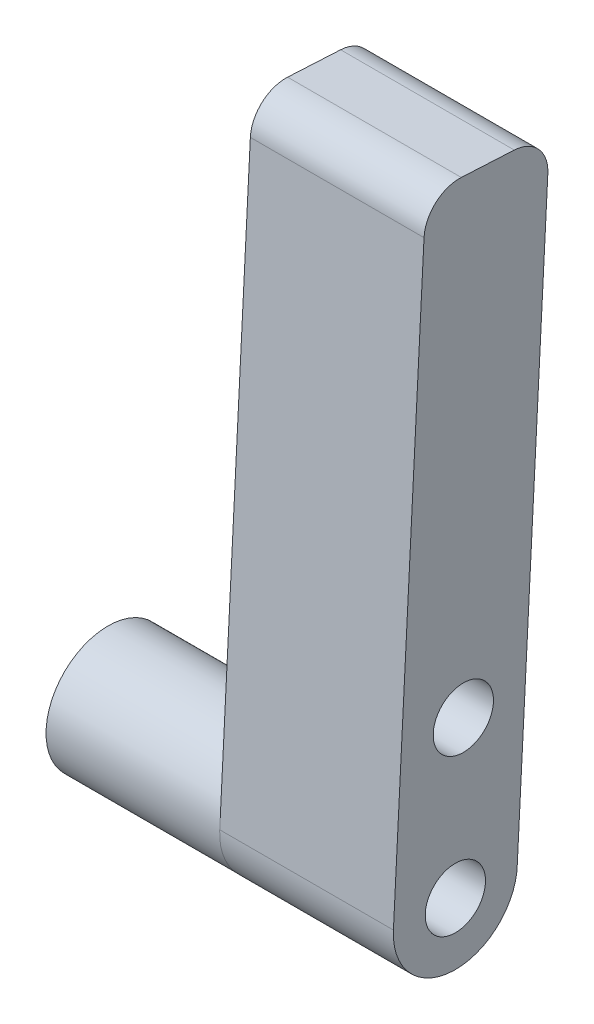
ISO-10303-21;
HEADER;
FILE_DESCRIPTION(('STEP AP214'),'2;1');
FILE_NAME('part.step','',(''),(''),'','','');
FILE_SCHEMA(('AUTOMOTIVE_DESIGN { 1 0 10303 214 1 1 1 1 }'));
ENDSEC;
DATA;
#1=APPLICATION_CONTEXT('core data for automotive mechanical design processes');
#2=APPLICATION_PROTOCOL_DEFINITION('international standard','automotive_design',2000,#1);
#3=PRODUCT_CONTEXT('',#1,'mechanical');
#4=PRODUCT('Part','Part','',(#3));
#5=PRODUCT_RELATED_PRODUCT_CATEGORY('part','',(#4));
#6=PRODUCT_DEFINITION_FORMATION('','',#4);
#7=PRODUCT_DEFINITION_CONTEXT('part definition',#1,'design');
#8=PRODUCT_DEFINITION('design','',#6,#7);
#9=PRODUCT_DEFINITION_SHAPE('','',#8);
#10=(LENGTH_UNIT() NAMED_UNIT(*) SI_UNIT(.MILLI.,.METRE.));
#11=(NAMED_UNIT(*) PLANE_ANGLE_UNIT() SI_UNIT($,.RADIAN.));
#12=(NAMED_UNIT(*) SI_UNIT($,.STERADIAN.) SOLID_ANGLE_UNIT());
#13=UNCERTAINTY_MEASURE_WITH_UNIT(LENGTH_MEASURE(1.E-05),#10,'distance_accuracy_value','');
#14=(GEOMETRIC_REPRESENTATION_CONTEXT(3) GLOBAL_UNCERTAINTY_ASSIGNED_CONTEXT((#13)) GLOBAL_UNIT_ASSIGNED_CONTEXT((#10,
#11,#12)) REPRESENTATION_CONTEXT('',''));
#15=CARTESIAN_POINT('',(0.,0.,0.));
#16=DIRECTION('',(0.,0.,1.));
#17=DIRECTION('',(1.,0.,0.));
#18=AXIS2_PLACEMENT_3D('',#15,#16,#17);
#19=CARTESIAN_POINT('',(10.,0.,17.6646125655959));
#20=DIRECTION('',(-1.,0.,0.));
#21=DIRECTION('',(0.,0.,1.));
#22=AXIS2_PLACEMENT_3D('',#19,#20,#21);
#23=CYLINDRICAL_SURFACE('',#22,1.70000000000002);
#24=CARTESIAN_POINT('',(0.2,0.,17.6646125655959));
#25=DIRECTION('',(1.,0.,0.));
#26=DIRECTION('',(0.,0.,-1.));
#27=AXIS2_PLACEMENT_3D('',#24,#25,#26);
#28=CIRCLE('',#27,1.70000000000002);
#29=CARTESIAN_POINT('',(0.2,0.,15.9646125655958));
#30=VERTEX_POINT('',#29);
#31=EDGE_CURVE('E147',#30,#30,#28,.T.);
#32=ORIENTED_EDGE('',*,*,#31,.F.);
#33=EDGE_LOOP('',(#32));
#34=FACE_BOUND('',#33,.T.);
#35=CARTESIAN_POINT('',(19.8,0.,17.6646125655959));
#36=DIRECTION('',(1.,0.,0.));
#37=DIRECTION('',(0.,0.,-1.));
#38=AXIS2_PLACEMENT_3D('',#35,#36,#37);
#39=CIRCLE('',#38,1.70000000000002);
#40=CARTESIAN_POINT('',(19.8,0.,15.9646125655958));
#41=VERTEX_POINT('',#40);
#42=EDGE_CURVE('E131',#41,#41,#39,.T.);
#43=ORIENTED_EDGE('',*,*,#42,.T.);
#44=EDGE_LOOP('',(#43));
#45=FACE_BOUND('',#44,.T.);
#46=ADVANCED_FACE('F41',(#34,#45),#23,.F.);
#47=CARTESIAN_POINT('',(10.,0.,17.6646125655959));
#48=DIRECTION('',(-1.,0.,0.));
#49=DIRECTION('',(0.,0.,1.));
#50=AXIS2_PLACEMENT_3D('',#47,#48,#49);
#51=CYLINDRICAL_SURFACE('',#50,3.49520337164101);
#52=CARTESIAN_POINT('',(10.,0.,17.6646125655959));
#53=DIRECTION('',(1.,0.,0.));
#54=DIRECTION('',(0.,0.,-1.));
#55=AXIS2_PLACEMENT_3D('',#52,#53,#54);
#56=CIRCLE('',#55,3.49520337164101);
#57=CARTESIAN_POINT('',(10.,0.,14.1694091939549));
#58=VERTEX_POINT('',#57);
#59=EDGE_CURVE('E11',#58,#58,#56,.T.);
#60=ORIENTED_EDGE('',*,*,#59,.F.);
#61=EDGE_LOOP('',(#60));
#62=FACE_BOUND('',#61,.T.);
#63=CARTESIAN_POINT('',(0.2,0.,17.6646125655959));
#64=DIRECTION('',(1.,0.,0.));
#65=DIRECTION('',(0.,0.,-1.));
#66=AXIS2_PLACEMENT_3D('',#63,#64,#65);
#67=CIRCLE('',#66,3.49520337164101);
#68=CARTESIAN_POINT('',(0.2,0.,14.1694091939549));
#69=VERTEX_POINT('',#68);
#70=EDGE_CURVE('E44',#69,#69,#67,.T.);
#71=ORIENTED_EDGE('',*,*,#70,.T.);
#72=EDGE_LOOP('',(#71));
#73=FACE_BOUND('',#72,.T.);
#74=ADVANCED_FACE('F154',(#62,#73),#51,.T.);
#75=CARTESIAN_POINT('',(0.2,0.,0.));
#76=DIRECTION('',(1.,0.,0.));
#77=DIRECTION('',(0.,0.,-1.));
#78=AXIS2_PLACEMENT_3D('',#75,#76,#77);
#79=PLANE('',#78);
#80=ORIENTED_EDGE('',*,*,#31,.T.);
#81=EDGE_LOOP('',(#80));
#82=FACE_BOUND('',#81,.T.);
#83=ORIENTED_EDGE('',*,*,#70,.F.);
#84=EDGE_LOOP('',(#83));
#85=FACE_BOUND('',#84,.T.);
#86=ADVANCED_FACE('F156',(#82,#85),#79,.F.);
#87=CARTESIAN_POINT('',(19.8,33.047127737817,17.434744508171));
#88=DIRECTION('',(1.,0.,0.));
#89=DIRECTION('',(0.,0.,-1.));
#90=AXIS2_PLACEMENT_3D('',#87,#88,#89);
#91=PLANE('',#90);
#92=ORIENTED_EDGE('',*,*,#42,.F.);
#93=EDGE_LOOP('',(#92));
#94=FACE_BOUND('',#93,.T.);
#95=DIRECTION('',(0.,0.0523359562429373,0.998629534754574));
#96=VECTOR('',#95,1.);
#97=CARTESIAN_POINT('',(19.8,34.0426554701117,-1.78409997408601));
#98=LINE('',#97,#96);
#99=CARTESIAN_POINT('',(19.8,34.8876299747292,14.3389740461679));
#100=VERTEX_POINT('',#99);
#101=CARTESIAN_POINT('',(19.8,35.0443868073261,17.3300725956851));
#102=VERTEX_POINT('',#101);
#103=EDGE_CURVE('E140',#100,#102,#98,.T.);
#104=ORIENTED_EDGE('',*,*,#103,.T.);
#105=CARTESIAN_POINT('',(19.8,33.047127737817,17.434744508171));
#106=DIRECTION('',(1.,0.,0.));
#107=DIRECTION('',(0.,0.,-1.));
#108=AXIS2_PLACEMENT_3D('',#105,#106,#107);
#109=CIRCLE('',#108,2.);
#110=CARTESIAN_POINT('',(19.8,33.1517996503028,19.4320035776801));
#111=VERTEX_POINT('',#110);
#112=EDGE_CURVE('E96',#102,#111,#109,.T.);
#113=ORIENTED_EDGE('',*,*,#112,.T.);
#114=DIRECTION('',(0.,0.998629534754574,-0.052335956242937));
#115=VECTOR('',#114,1.);
#116=CARTESIAN_POINT('',(19.8,1.10640324970027,21.1114316392803));
#117=LINE('',#116,#115);
#118=CARTESIAN_POINT('',(19.8,0.183175846850278,21.1598159372369));
#119=VERTEX_POINT('',#118);
#120=EDGE_CURVE('E111',#119,#111,#117,.T.);
#121=ORIENTED_EDGE('',*,*,#120,.F.);
#122=CARTESIAN_POINT('',(19.8,0.,17.6646125655959));
#123=DIRECTION('',(1.,0.,0.));
#124=DIRECTION('',(0.,0.,-1.));
#125=AXIS2_PLACEMENT_3D('',#122,#123,#124);
#126=CIRCLE('',#125,3.5);
#127=CARTESIAN_POINT('',(19.8,0.,14.1646125655959));
#128=VERTEX_POINT('',#127);
#129=EDGE_CURVE('E104',#119,#128,#126,.T.);
#130=ORIENTED_EDGE('',*,*,#129,.T.);
#131=DIRECTION('',(0.,0.998629534754574,-0.0523359562429369));
#132=VECTOR('',#131,1.);
#133=CARTESIAN_POINT('',(19.8,0.740302592131617,14.1258149507448));
#134=LINE('',#133,#132);
#135=CARTESIAN_POINT('',(19.8,32.7856989927342,12.4463868891446));
#136=VERTEX_POINT('',#135);
#137=EDGE_CURVE('E109',#128,#136,#134,.T.);
#138=ORIENTED_EDGE('',*,*,#137,.T.);
#139=CARTESIAN_POINT('',(19.8,32.89037090522,14.4436459586538));
#140=DIRECTION('',(1.,0.,0.));
#141=DIRECTION('',(0.,0.,-1.));
#142=AXIS2_PLACEMENT_3D('',#139,#140,#141);
#143=CIRCLE('',#142,2.);
#144=EDGE_CURVE('E58',#136,#100,#143,.T.);
#145=ORIENTED_EDGE('',*,*,#144,.T.);
#146=EDGE_LOOP('',(#104,#113,#121,#130,#138,#145));
#147=FACE_BOUND('',#146,.T.);
#148=CARTESIAN_POINT('',(19.8,8.58821399888934,17.2145233419066));
#149=DIRECTION('',(1.,0.,0.));
#150=DIRECTION('',(0.,0.,-1.));
#151=AXIS2_PLACEMENT_3D('',#148,#149,#150);
#152=CIRCLE('',#151,1.7);
#153=CARTESIAN_POINT('',(19.8,8.58821399888934,15.5145233419066));
#154=VERTEX_POINT('',#153);
#155=EDGE_CURVE('E178',#154,#154,#152,.T.);
#156=ORIENTED_EDGE('',*,*,#155,.F.);
#157=EDGE_LOOP('',(#156));
#158=FACE_BOUND('',#157,.T.);
#159=ADVANCED_FACE('F106',(#94,#147,#158),#91,.T.);
#160=CARTESIAN_POINT('',(10.,33.047127737817,17.434744508171));
#161=DIRECTION('',(1.,0.,0.));
#162=DIRECTION('',(0.,0.,-1.));
#163=AXIS2_PLACEMENT_3D('',#160,#161,#162);
#164=PLANE('',#163);
#165=ORIENTED_EDGE('',*,*,#59,.T.);
#166=EDGE_LOOP('',(#165));
#167=FACE_BOUND('',#166,.T.);
#168=DIRECTION('',(0.,0.0523359562429373,0.998629534754574));
#169=VECTOR('',#168,1.);
#170=CARTESIAN_POINT('',(10.,34.0426554701117,-1.78409997408601));
#171=LINE('',#170,#169);
#172=CARTESIAN_POINT('',(10.,34.8876299747292,14.3389740461679));
#173=VERTEX_POINT('',#172);
#174=CARTESIAN_POINT('',(10.,35.0443868073261,17.3300725956851));
#175=VERTEX_POINT('',#174);
#176=EDGE_CURVE('E127',#173,#175,#171,.T.);
#177=ORIENTED_EDGE('',*,*,#176,.F.);
#178=CARTESIAN_POINT('',(10.,32.89037090522,14.4436459586538));
#179=DIRECTION('',(1.,0.,0.));
#180=DIRECTION('',(0.,0.,-1.));
#181=AXIS2_PLACEMENT_3D('',#178,#179,#180);
#182=CIRCLE('',#181,2.);
#183=CARTESIAN_POINT('',(10.,32.7856989927342,12.4463868891446));
#184=VERTEX_POINT('',#183);
#185=EDGE_CURVE('E87',#184,#173,#182,.T.);
#186=ORIENTED_EDGE('',*,*,#185,.F.);
#187=DIRECTION('',(0.,0.998629534754574,-0.0523359562429369));
#188=VECTOR('',#187,1.);
#189=CARTESIAN_POINT('',(10.,0.740302592131617,14.1258149507448));
#190=LINE('',#189,#188);
#191=CARTESIAN_POINT('',(10.,0.,14.1646125655959));
#192=VERTEX_POINT('',#191);
#193=EDGE_CURVE('E81',#192,#184,#190,.T.);
#194=ORIENTED_EDGE('',*,*,#193,.F.);
#195=CARTESIAN_POINT('',(10.,0.,17.6646125655959));
#196=DIRECTION('',(1.,0.,0.));
#197=DIRECTION('',(0.,0.,-1.));
#198=AXIS2_PLACEMENT_3D('',#195,#196,#197);
#199=CIRCLE('',#198,3.5);
#200=CARTESIAN_POINT('',(10.,0.183175846850278,21.1598159372369));
#201=VERTEX_POINT('',#200);
#202=EDGE_CURVE('E117',#201,#192,#199,.T.);
#203=ORIENTED_EDGE('',*,*,#202,.F.);
#204=DIRECTION('',(0.,0.998629534754574,-0.052335956242937));
#205=VECTOR('',#204,1.);
#206=CARTESIAN_POINT('',(10.,1.10640324970027,21.1114316392803));
#207=LINE('',#206,#205);
#208=CARTESIAN_POINT('',(10.,33.1517996503028,19.4320035776801));
#209=VERTEX_POINT('',#208);
#210=EDGE_CURVE('E134',#201,#209,#207,.T.);
#211=ORIENTED_EDGE('',*,*,#210,.T.);
#212=CARTESIAN_POINT('',(10.,33.047127737817,17.434744508171));
#213=DIRECTION('',(1.,0.,0.));
#214=DIRECTION('',(0.,0.,-1.));
#215=AXIS2_PLACEMENT_3D('',#212,#213,#214);
#216=CIRCLE('',#215,2.);
#217=EDGE_CURVE('E130',#175,#209,#216,.T.);
#218=ORIENTED_EDGE('',*,*,#217,.F.);
#219=EDGE_LOOP('',(#177,#186,#194,#203,#211,#218));
#220=FACE_BOUND('',#219,.T.);
#221=CARTESIAN_POINT('',(10.,8.58821399888934,17.2145233419066));
#222=DIRECTION('',(1.,0.,0.));
#223=DIRECTION('',(0.,0.,-1.));
#224=AXIS2_PLACEMENT_3D('',#221,#222,#223);
#225=CIRCLE('',#224,1.7);
#226=CARTESIAN_POINT('',(10.,8.58821399888934,15.5145233419066));
#227=VERTEX_POINT('',#226);
#228=EDGE_CURVE('E181',#227,#227,#225,.T.);
#229=ORIENTED_EDGE('',*,*,#228,.T.);
#230=EDGE_LOOP('',(#229));
#231=FACE_BOUND('',#230,.T.);
#232=ADVANCED_FACE('F164',(#167,#220,#231),#164,.F.);
#233=CARTESIAN_POINT('',(19.8,34.0426554701117,-1.78409997408601));
#234=DIRECTION('',(0.,-0.998629534754574,0.0523359562429373));
#235=DIRECTION('',(0.,-0.0523359562429373,-0.998629534754574));
#236=AXIS2_PLACEMENT_3D('',#233,#234,#235);
#237=PLANE('',#236);
#238=ORIENTED_EDGE('',*,*,#176,.T.);
#239=DIRECTION('',(-1.,0.,0.));
#240=VECTOR('',#239,1.);
#241=CARTESIAN_POINT('',(19.8,35.0443868073261,17.3300725956851));
#242=LINE('',#241,#240);
#243=EDGE_CURVE('E146',#102,#175,#242,.T.);
#244=ORIENTED_EDGE('',*,*,#243,.F.);
#245=ORIENTED_EDGE('',*,*,#103,.F.);
#246=DIRECTION('',(-1.,0.,0.));
#247=VECTOR('',#246,1.);
#248=CARTESIAN_POINT('',(19.8,34.8876299747292,14.3389740461679));
#249=LINE('',#248,#247);
#250=EDGE_CURVE('E123',#100,#173,#249,.T.);
#251=ORIENTED_EDGE('',*,*,#250,.T.);
#252=EDGE_LOOP('',(#238,#244,#245,#251));
#253=FACE_BOUND('',#252,.T.);
#254=ADVANCED_FACE('F194',(#253),#237,.F.);
#255=CARTESIAN_POINT('',(19.8,33.047127737817,17.434744508171));
#256=DIRECTION('',(-1.,0.,0.));
#257=DIRECTION('',(0.,0.,1.));
#258=AXIS2_PLACEMENT_3D('',#255,#256,#257);
#259=CYLINDRICAL_SURFACE('',#258,2.);
#260=ORIENTED_EDGE('',*,*,#217,.T.);
#261=DIRECTION('',(-1.,0.,0.));
#262=VECTOR('',#261,1.);
#263=CARTESIAN_POINT('',(19.8,33.1517996503028,19.4320035776801));
#264=LINE('',#263,#262);
#265=EDGE_CURVE('E144',#111,#209,#264,.T.);
#266=ORIENTED_EDGE('',*,*,#265,.F.);
#267=ORIENTED_EDGE('',*,*,#112,.F.);
#268=ORIENTED_EDGE('',*,*,#243,.T.);
#269=EDGE_LOOP('',(#260,#266,#267,#268));
#270=FACE_BOUND('',#269,.T.);
#271=ADVANCED_FACE('F214',(#270),#259,.T.);
#272=CARTESIAN_POINT('',(19.8,1.10640324970027,21.1114316392803));
#273=DIRECTION('',(0.,0.052335956242937,0.998629534754574));
#274=DIRECTION('',(0.,-0.998629534754574,0.052335956242937));
#275=AXIS2_PLACEMENT_3D('',#272,#273,#274);
#276=PLANE('',#275);
#277=ORIENTED_EDGE('',*,*,#210,.F.);
#278=DIRECTION('',(-1.,0.,0.));
#279=VECTOR('',#278,1.);
#280=CARTESIAN_POINT('',(19.8,0.183175846850278,21.1598159372369));
#281=LINE('',#280,#279);
#282=EDGE_CURVE('E118',#119,#201,#281,.T.);
#283=ORIENTED_EDGE('',*,*,#282,.F.);
#284=ORIENTED_EDGE('',*,*,#120,.T.);
#285=ORIENTED_EDGE('',*,*,#265,.T.);
#286=EDGE_LOOP('',(#277,#283,#284,#285));
#287=FACE_BOUND('',#286,.T.);
#288=ADVANCED_FACE('F188',(#287),#276,.T.);
#289=CARTESIAN_POINT('',(19.8,0.,17.6646125655959));
#290=DIRECTION('',(-1.,0.,0.));
#291=DIRECTION('',(0.,0.,1.));
#292=AXIS2_PLACEMENT_3D('',#289,#290,#291);
#293=CYLINDRICAL_SURFACE('',#292,3.5);
#294=ORIENTED_EDGE('',*,*,#202,.T.);
#295=DIRECTION('',(-1.,0.,0.));
#296=VECTOR('',#295,1.);
#297=CARTESIAN_POINT('',(19.8,0.,14.1646125655959));
#298=LINE('',#297,#296);
#299=EDGE_CURVE('E114',#128,#192,#298,.T.);
#300=ORIENTED_EDGE('',*,*,#299,.F.);
#301=ORIENTED_EDGE('',*,*,#129,.F.);
#302=ORIENTED_EDGE('',*,*,#282,.T.);
#303=EDGE_LOOP('',(#294,#300,#301,#302));
#304=FACE_BOUND('',#303,.T.);
#305=ADVANCED_FACE('F115',(#304),#293,.T.);
#306=CARTESIAN_POINT('',(19.8,0.740302592131617,14.1258149507448));
#307=DIRECTION('',(0.,0.0523359562429369,0.998629534754574));
#308=DIRECTION('',(0.,-0.998629534754574,0.0523359562429369));
#309=AXIS2_PLACEMENT_3D('',#306,#307,#308);
#310=PLANE('',#309);
#311=ORIENTED_EDGE('',*,*,#193,.T.);
#312=DIRECTION('',(-1.,0.,0.));
#313=VECTOR('',#312,1.);
#314=CARTESIAN_POINT('',(19.8,32.7856989927342,12.4463868891446));
#315=LINE('',#314,#313);
#316=EDGE_CURVE('E119',#136,#184,#315,.T.);
#317=ORIENTED_EDGE('',*,*,#316,.F.);
#318=ORIENTED_EDGE('',*,*,#137,.F.);
#319=ORIENTED_EDGE('',*,*,#299,.T.);
#320=EDGE_LOOP('',(#311,#317,#318,#319));
#321=FACE_BOUND('',#320,.T.);
#322=ADVANCED_FACE('F121',(#321),#310,.F.);
#323=CARTESIAN_POINT('',(19.8,32.89037090522,14.4436459586538));
#324=DIRECTION('',(-1.,0.,0.));
#325=DIRECTION('',(0.,0.,1.));
#326=AXIS2_PLACEMENT_3D('',#323,#324,#325);
#327=CYLINDRICAL_SURFACE('',#326,2.);
#328=ORIENTED_EDGE('',*,*,#185,.T.);
#329=ORIENTED_EDGE('',*,*,#250,.F.);
#330=ORIENTED_EDGE('',*,*,#144,.F.);
#331=ORIENTED_EDGE('',*,*,#316,.T.);
#332=EDGE_LOOP('',(#328,#329,#330,#331));
#333=FACE_BOUND('',#332,.T.);
#334=ADVANCED_FACE('F196',(#333),#327,.T.);
#335=CARTESIAN_POINT('',(19.8,8.58821399888934,17.2145233419066));
#336=DIRECTION('',(-1.,0.,0.));
#337=DIRECTION('',(0.,0.,1.));
#338=AXIS2_PLACEMENT_3D('',#335,#336,#337);
#339=CYLINDRICAL_SURFACE('',#338,1.7);
#340=ORIENTED_EDGE('',*,*,#155,.T.);
#341=EDGE_LOOP('',(#340));
#342=FACE_BOUND('',#341,.T.);
#343=ORIENTED_EDGE('',*,*,#228,.F.);
#344=EDGE_LOOP('',(#343));
#345=FACE_BOUND('',#344,.T.);
#346=ADVANCED_FACE('F198',(#342,#345),#339,.F.);
#347=CLOSED_SHELL('',(#46,#74,#86,#159,#232,#254,#271,#288,#305,#322,#334,#346));
#348=MANIFOLD_SOLID_BREP('B2',#347);
#349=ADVANCED_BREP_SHAPE_REPRESENTATION('',(#18,#348),#14);
#350=SHAPE_DEFINITION_REPRESENTATION(#9,#349);
ENDSEC;
END-ISO-10303-21;
